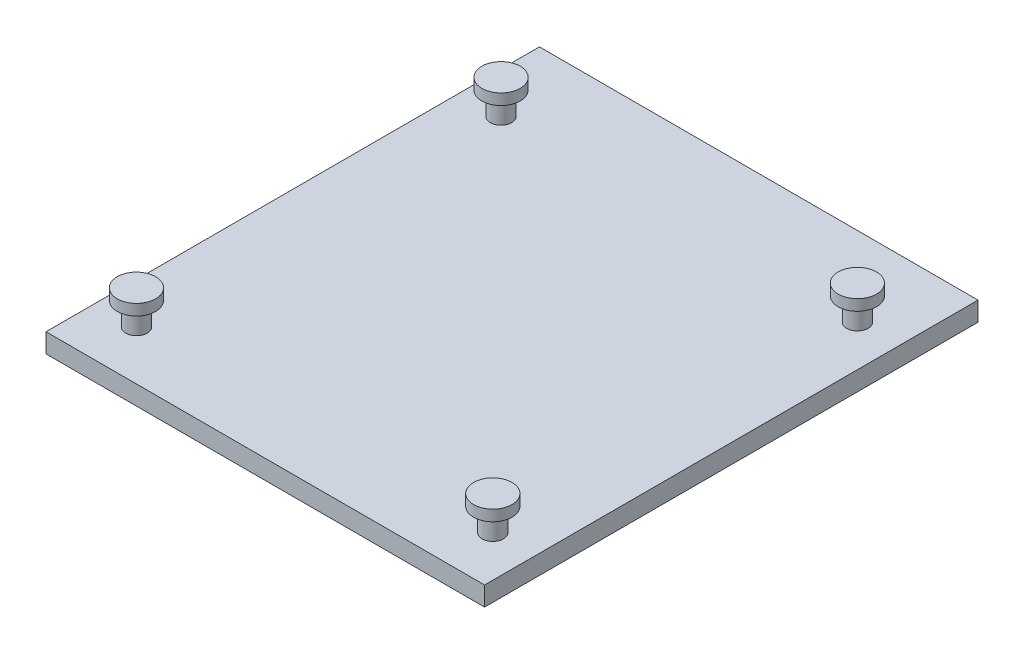
ISO-10303-21;
HEADER;
FILE_DESCRIPTION(('STEP AP214'),'2;1');
FILE_NAME('part.step','',(''),(''),'','','');
FILE_SCHEMA(('AUTOMOTIVE_DESIGN { 1 0 10303 214 1 1 1 1 }'));
ENDSEC;
DATA;
#1=APPLICATION_CONTEXT('core data for automotive mechanical design processes');
#2=APPLICATION_PROTOCOL_DEFINITION('international standard','automotive_design',2000,#1);
#3=PRODUCT_CONTEXT('',#1,'mechanical');
#4=PRODUCT('Part','Part','',(#3));
#5=PRODUCT_RELATED_PRODUCT_CATEGORY('part','',(#4));
#6=PRODUCT_DEFINITION_FORMATION('','',#4);
#7=PRODUCT_DEFINITION_CONTEXT('part definition',#1,'design');
#8=PRODUCT_DEFINITION('design','',#6,#7);
#9=PRODUCT_DEFINITION_SHAPE('','',#8);
#10=(LENGTH_UNIT() NAMED_UNIT(*) SI_UNIT(.MILLI.,.METRE.));
#11=(NAMED_UNIT(*) PLANE_ANGLE_UNIT() SI_UNIT($,.RADIAN.));
#12=(NAMED_UNIT(*) SI_UNIT($,.STERADIAN.) SOLID_ANGLE_UNIT());
#13=UNCERTAINTY_MEASURE_WITH_UNIT(LENGTH_MEASURE(1.E-05),#10,'distance_accuracy_value','');
#14=(GEOMETRIC_REPRESENTATION_CONTEXT(3) GLOBAL_UNCERTAINTY_ASSIGNED_CONTEXT((#13)) GLOBAL_UNIT_ASSIGNED_CONTEXT((#10,
#11,#12)) REPRESENTATION_CONTEXT('',''));
#15=CARTESIAN_POINT('',(0.,0.,0.));
#16=DIRECTION('',(0.,0.,1.));
#17=DIRECTION('',(1.,0.,0.));
#18=AXIS2_PLACEMENT_3D('',#15,#16,#17);
#19=CARTESIAN_POINT('',(40.,-3.5,45.));
#20=DIRECTION('',(1.,0.,0.));
#21=DIRECTION('',(0.,0.,-1.));
#22=AXIS2_PLACEMENT_3D('',#19,#20,#21);
#23=PLANE('',#22);
#24=DIRECTION('',(0.,0.,-1.));
#25=VECTOR('',#24,1.);
#26=CARTESIAN_POINT('',(40.,0.,45.));
#27=LINE('',#26,#25);
#28=CARTESIAN_POINT('',(40.,0.,45.));
#29=VERTEX_POINT('',#28);
#30=CARTESIAN_POINT('',(40.,0.,-45.));
#31=VERTEX_POINT('',#30);
#32=EDGE_CURVE('E113',#29,#31,#27,.T.);
#33=ORIENTED_EDGE('',*,*,#32,.F.);
#34=DIRECTION('',(0.,1.,0.));
#35=VECTOR('',#34,1.);
#36=CARTESIAN_POINT('',(40.,-3.5,45.));
#37=LINE('',#36,#35);
#38=CARTESIAN_POINT('',(40.,-3.5,45.));
#39=VERTEX_POINT('',#38);
#40=EDGE_CURVE('E56',#39,#29,#37,.T.);
#41=ORIENTED_EDGE('',*,*,#40,.F.);
#42=DIRECTION('',(0.,0.,-1.));
#43=VECTOR('',#42,1.);
#44=CARTESIAN_POINT('',(40.,-3.5,45.));
#45=LINE('',#44,#43);
#46=CARTESIAN_POINT('',(40.,-3.5,-45.));
#47=VERTEX_POINT('',#46);
#48=EDGE_CURVE('E104',#39,#47,#45,.T.);
#49=ORIENTED_EDGE('',*,*,#48,.T.);
#50=DIRECTION('',(0.,1.,0.));
#51=VECTOR('',#50,1.);
#52=CARTESIAN_POINT('',(40.,-3.5,-45.));
#53=LINE('',#52,#51);
#54=EDGE_CURVE('E84',#47,#31,#53,.T.);
#55=ORIENTED_EDGE('',*,*,#54,.T.);
#56=EDGE_LOOP('',(#33,#41,#49,#55));
#57=FACE_BOUND('',#56,.T.);
#58=ADVANCED_FACE('F39',(#57),#23,.T.);
#59=CARTESIAN_POINT('',(-40.,-3.5,45.));
#60=DIRECTION('',(0.,0.,1.));
#61=DIRECTION('',(1.,0.,0.));
#62=AXIS2_PLACEMENT_3D('',#59,#60,#61);
#63=PLANE('',#62);
#64=DIRECTION('',(1.,0.,0.));
#65=VECTOR('',#64,1.);
#66=CARTESIAN_POINT('',(-40.,0.,45.));
#67=LINE('',#66,#65);
#68=CARTESIAN_POINT('',(-40.,0.,45.));
#69=VERTEX_POINT('',#68);
#70=EDGE_CURVE('E107',#69,#29,#67,.T.);
#71=ORIENTED_EDGE('',*,*,#70,.F.);
#72=DIRECTION('',(0.,1.,0.));
#73=VECTOR('',#72,1.);
#74=CARTESIAN_POINT('',(-40.,-3.5,45.));
#75=LINE('',#74,#73);
#76=CARTESIAN_POINT('',(-40.,-3.5,45.));
#77=VERTEX_POINT('',#76);
#78=EDGE_CURVE('E73',#77,#69,#75,.T.);
#79=ORIENTED_EDGE('',*,*,#78,.F.);
#80=DIRECTION('',(1.,0.,0.));
#81=VECTOR('',#80,1.);
#82=CARTESIAN_POINT('',(-40.,-3.5,45.));
#83=LINE('',#82,#81);
#84=EDGE_CURVE('E99',#77,#39,#83,.T.);
#85=ORIENTED_EDGE('',*,*,#84,.T.);
#86=ORIENTED_EDGE('',*,*,#40,.T.);
#87=EDGE_LOOP('',(#71,#79,#85,#86));
#88=FACE_BOUND('',#87,.T.);
#89=ADVANCED_FACE('F155',(#88),#63,.T.);
#90=CARTESIAN_POINT('',(-40.,-3.5,45.));
#91=DIRECTION('',(-1.,0.,0.));
#92=DIRECTION('',(0.,0.,1.));
#93=AXIS2_PLACEMENT_3D('',#90,#91,#92);
#94=PLANE('',#93);
#95=DIRECTION('',(0.,0.,1.));
#96=VECTOR('',#95,1.);
#97=CARTESIAN_POINT('',(-40.,0.,45.));
#98=LINE('',#97,#96);
#99=CARTESIAN_POINT('',(-40.,0.,-45.));
#100=VERTEX_POINT('',#99);
#101=EDGE_CURVE('E92',#100,#69,#98,.T.);
#102=ORIENTED_EDGE('',*,*,#101,.F.);
#103=DIRECTION('',(0.,1.,0.));
#104=VECTOR('',#103,1.);
#105=CARTESIAN_POINT('',(-40.,-3.5,-45.));
#106=LINE('',#105,#104);
#107=CARTESIAN_POINT('',(-40.,-3.5,-45.));
#108=VERTEX_POINT('',#107);
#109=EDGE_CURVE('E87',#108,#100,#106,.T.);
#110=ORIENTED_EDGE('',*,*,#109,.F.);
#111=DIRECTION('',(0.,0.,1.));
#112=VECTOR('',#111,1.);
#113=CARTESIAN_POINT('',(-40.,-3.5,45.));
#114=LINE('',#113,#112);
#115=EDGE_CURVE('E90',#108,#77,#114,.T.);
#116=ORIENTED_EDGE('',*,*,#115,.T.);
#117=ORIENTED_EDGE('',*,*,#78,.T.);
#118=EDGE_LOOP('',(#102,#110,#116,#117));
#119=FACE_BOUND('',#118,.T.);
#120=ADVANCED_FACE('F89',(#119),#94,.T.);
#121=CARTESIAN_POINT('',(-40.,-3.5,-45.));
#122=DIRECTION('',(0.,0.,-1.));
#123=DIRECTION('',(-1.,0.,0.));
#124=AXIS2_PLACEMENT_3D('',#121,#122,#123);
#125=PLANE('',#124);
#126=DIRECTION('',(-1.,0.,0.));
#127=VECTOR('',#126,1.);
#128=CARTESIAN_POINT('',(-40.,0.,-45.));
#129=LINE('',#128,#127);
#130=EDGE_CURVE('E117',#31,#100,#129,.T.);
#131=ORIENTED_EDGE('',*,*,#130,.F.);
#132=ORIENTED_EDGE('',*,*,#54,.F.);
#133=DIRECTION('',(-1.,0.,0.));
#134=VECTOR('',#133,1.);
#135=CARTESIAN_POINT('',(-40.,-3.5,-45.));
#136=LINE('',#135,#134);
#137=EDGE_CURVE('E98',#47,#108,#136,.T.);
#138=ORIENTED_EDGE('',*,*,#137,.T.);
#139=ORIENTED_EDGE('',*,*,#109,.T.);
#140=EDGE_LOOP('',(#131,#132,#138,#139));
#141=FACE_BOUND('',#140,.T.);
#142=ADVANCED_FACE('F102',(#141),#125,.T.);
#143=CARTESIAN_POINT('',(0.,-3.5,0.));
#144=DIRECTION('',(0.,-1.,0.));
#145=DIRECTION('',(0.,0.,-1.));
#146=AXIS2_PLACEMENT_3D('',#143,#144,#145);
#147=PLANE('',#146);
#148=ORIENTED_EDGE('',*,*,#48,.F.);
#149=ORIENTED_EDGE('',*,*,#84,.F.);
#150=ORIENTED_EDGE('',*,*,#115,.F.);
#151=ORIENTED_EDGE('',*,*,#137,.F.);
#152=EDGE_LOOP('',(#148,#149,#150,#151));
#153=FACE_BOUND('',#152,.T.);
#154=ADVANCED_FACE('F97',(#153),#147,.T.);
#155=CARTESIAN_POINT('',(0.,0.,0.));
#156=DIRECTION('',(0.,-1.,0.));
#157=DIRECTION('',(0.,0.,-1.));
#158=AXIS2_PLACEMENT_3D('',#155,#156,#157);
#159=PLANE('',#158);
#160=CARTESIAN_POINT('',(-32.5,0.,36.));
#161=DIRECTION('',(0.,-1.,0.));
#162=DIRECTION('',(0.,0.,-1.));
#163=AXIS2_PLACEMENT_3D('',#160,#161,#162);
#164=CIRCLE('',#163,1.95);
#165=CARTESIAN_POINT('',(-32.5,0.,34.05));
#166=VERTEX_POINT('',#165);
#167=EDGE_CURVE('E11',#166,#166,#164,.F.);
#168=ORIENTED_EDGE('',*,*,#167,.F.);
#169=EDGE_LOOP('',(#168));
#170=FACE_BOUND('',#169,.T.);
#171=CARTESIAN_POINT('',(32.5,0.,36.));
#172=DIRECTION('',(0.,-1.,0.));
#173=DIRECTION('',(0.,0.,-1.));
#174=AXIS2_PLACEMENT_3D('',#171,#172,#173);
#175=CIRCLE('',#174,1.95);
#176=CARTESIAN_POINT('',(32.5,0.,34.05));
#177=VERTEX_POINT('',#176);
#178=EDGE_CURVE('E48',#177,#177,#175,.F.);
#179=ORIENTED_EDGE('',*,*,#178,.F.);
#180=EDGE_LOOP('',(#179));
#181=FACE_BOUND('',#180,.T.);
#182=CARTESIAN_POINT('',(32.5,0.,-30.5));
#183=DIRECTION('',(0.,-1.,0.));
#184=DIRECTION('',(0.,0.,-1.));
#185=AXIS2_PLACEMENT_3D('',#182,#183,#184);
#186=CIRCLE('',#185,1.95);
#187=CARTESIAN_POINT('',(32.5,0.,-32.45));
#188=VERTEX_POINT('',#187);
#189=EDGE_CURVE('E136',#188,#188,#186,.F.);
#190=ORIENTED_EDGE('',*,*,#189,.F.);
#191=EDGE_LOOP('',(#190));
#192=FACE_BOUND('',#191,.T.);
#193=CARTESIAN_POINT('',(-32.5,0.,-30.5));
#194=DIRECTION('',(0.,-1.,0.));
#195=DIRECTION('',(0.,0.,-1.));
#196=AXIS2_PLACEMENT_3D('',#193,#194,#195);
#197=CIRCLE('',#196,1.95);
#198=CARTESIAN_POINT('',(-32.5,0.,-32.45));
#199=VERTEX_POINT('',#198);
#200=EDGE_CURVE('E128',#199,#199,#197,.F.);
#201=ORIENTED_EDGE('',*,*,#200,.F.);
#202=EDGE_LOOP('',(#201));
#203=FACE_BOUND('',#202,.T.);
#204=ORIENTED_EDGE('',*,*,#32,.T.);
#205=ORIENTED_EDGE('',*,*,#130,.T.);
#206=ORIENTED_EDGE('',*,*,#101,.T.);
#207=ORIENTED_EDGE('',*,*,#70,.T.);
#208=EDGE_LOOP('',(#204,#205,#206,#207));
#209=FACE_BOUND('',#208,.T.);
#210=ADVANCED_FACE('F145',(#170,#181,#192,#203,#209),#159,.F.);
#211=CARTESIAN_POINT('',(-32.5,4.2,-30.5));
#212=DIRECTION('',(0.,-1.,0.));
#213=DIRECTION('',(0.,0.,-1.));
#214=AXIS2_PLACEMENT_3D('',#211,#212,#213);
#215=CYLINDRICAL_SURFACE('',#214,1.95);
#216=CARTESIAN_POINT('',(-32.5,4.2,-30.5));
#217=DIRECTION('',(0.,1.,0.));
#218=DIRECTION('',(0.,0.,1.));
#219=AXIS2_PLACEMENT_3D('',#216,#217,#218);
#220=CIRCLE('',#219,1.95);
#221=CARTESIAN_POINT('',(-32.5,4.2,-28.55));
#222=VERTEX_POINT('',#221);
#223=EDGE_CURVE('E118',#222,#222,#220,.T.);
#224=ORIENTED_EDGE('',*,*,#223,.F.);
#225=EDGE_LOOP('',(#224));
#226=FACE_BOUND('',#225,.T.);
#227=ORIENTED_EDGE('',*,*,#200,.T.);
#228=EDGE_LOOP('',(#227));
#229=FACE_BOUND('',#228,.T.);
#230=ADVANCED_FACE('F148',(#226,#229),#215,.T.);
#231=CARTESIAN_POINT('',(32.5,4.2,-30.5));
#232=DIRECTION('',(0.,-1.,0.));
#233=DIRECTION('',(0.,0.,-1.));
#234=AXIS2_PLACEMENT_3D('',#231,#232,#233);
#235=CYLINDRICAL_SURFACE('',#234,1.95);
#236=CARTESIAN_POINT('',(32.5,4.2,-30.5));
#237=DIRECTION('',(0.,1.,0.));
#238=DIRECTION('',(0.,0.,1.));
#239=AXIS2_PLACEMENT_3D('',#236,#237,#238);
#240=CIRCLE('',#239,1.95);
#241=CARTESIAN_POINT('',(32.5,4.2,-28.55));
#242=VERTEX_POINT('',#241);
#243=EDGE_CURVE('E276',#242,#242,#240,.T.);
#244=ORIENTED_EDGE('',*,*,#243,.F.);
#245=EDGE_LOOP('',(#244));
#246=FACE_BOUND('',#245,.T.);
#247=ORIENTED_EDGE('',*,*,#189,.T.);
#248=EDGE_LOOP('',(#247));
#249=FACE_BOUND('',#248,.T.);
#250=ADVANCED_FACE('F173',(#246,#249),#235,.T.);
#251=CARTESIAN_POINT('',(32.5,4.2,36.));
#252=DIRECTION('',(0.,-1.,0.));
#253=DIRECTION('',(0.,0.,-1.));
#254=AXIS2_PLACEMENT_3D('',#251,#252,#253);
#255=CYLINDRICAL_SURFACE('',#254,1.95);
#256=CARTESIAN_POINT('',(32.5,4.2,36.));
#257=DIRECTION('',(0.,1.,0.));
#258=DIRECTION('',(0.,0.,1.));
#259=AXIS2_PLACEMENT_3D('',#256,#257,#258);
#260=CIRCLE('',#259,1.95);
#261=CARTESIAN_POINT('',(32.5,4.2,37.95));
#262=VERTEX_POINT('',#261);
#263=EDGE_CURVE('E272',#262,#262,#260,.T.);
#264=ORIENTED_EDGE('',*,*,#263,.F.);
#265=EDGE_LOOP('',(#264));
#266=FACE_BOUND('',#265,.T.);
#267=ORIENTED_EDGE('',*,*,#178,.T.);
#268=EDGE_LOOP('',(#267));
#269=FACE_BOUND('',#268,.T.);
#270=ADVANCED_FACE('F143',(#266,#269),#255,.T.);
#271=CARTESIAN_POINT('',(-32.5,4.2,36.));
#272=DIRECTION('',(0.,-1.,0.));
#273=DIRECTION('',(0.,0.,-1.));
#274=AXIS2_PLACEMENT_3D('',#271,#272,#273);
#275=CYLINDRICAL_SURFACE('',#274,1.95);
#276=CARTESIAN_POINT('',(-32.5,4.2,36.));
#277=DIRECTION('',(0.,1.,0.));
#278=DIRECTION('',(0.,0.,1.));
#279=AXIS2_PLACEMENT_3D('',#276,#277,#278);
#280=CIRCLE('',#279,1.95);
#281=CARTESIAN_POINT('',(-32.5,4.2,37.95));
#282=VERTEX_POINT('',#281);
#283=EDGE_CURVE('E265',#282,#282,#280,.T.);
#284=ORIENTED_EDGE('',*,*,#283,.F.);
#285=EDGE_LOOP('',(#284));
#286=FACE_BOUND('',#285,.T.);
#287=ORIENTED_EDGE('',*,*,#167,.T.);
#288=EDGE_LOOP('',(#287));
#289=FACE_BOUND('',#288,.T.);
#290=ADVANCED_FACE('F180',(#286,#289),#275,.T.);
#291=CARTESIAN_POINT('',(-32.5,6.2,-30.5));
#292=DIRECTION('',(0.,-1.,0.));
#293=DIRECTION('',(0.,0.,-1.));
#294=AXIS2_PLACEMENT_3D('',#291,#292,#293);
#295=CYLINDRICAL_SURFACE('',#294,3.5);
#296=CARTESIAN_POINT('',(-32.5,6.2,-30.5));
#297=DIRECTION('',(0.,1.,0.));
#298=DIRECTION('',(0.,0.,1.));
#299=AXIS2_PLACEMENT_3D('',#296,#297,#298);
#300=CIRCLE('',#299,3.5);
#301=CARTESIAN_POINT('',(-32.5,6.2,-27.));
#302=VERTEX_POINT('',#301);
#303=EDGE_CURVE('E261',#302,#302,#300,.T.);
#304=ORIENTED_EDGE('',*,*,#303,.F.);
#305=EDGE_LOOP('',(#304));
#306=FACE_BOUND('',#305,.T.);
#307=CARTESIAN_POINT('',(-32.5,4.2,-30.5));
#308=DIRECTION('',(0.,1.,0.));
#309=DIRECTION('',(0.,0.,1.));
#310=AXIS2_PLACEMENT_3D('',#307,#308,#309);
#311=CIRCLE('',#310,3.5);
#312=CARTESIAN_POINT('',(-32.5,4.2,-27.));
#313=VERTEX_POINT('',#312);
#314=EDGE_CURVE('E257',#313,#313,#311,.T.);
#315=ORIENTED_EDGE('',*,*,#314,.T.);
#316=EDGE_LOOP('',(#315));
#317=FACE_BOUND('',#316,.T.);
#318=ADVANCED_FACE('F184',(#306,#317),#295,.T.);
#319=CARTESIAN_POINT('',(-32.5,6.2,-30.5));
#320=DIRECTION('',(0.,1.,0.));
#321=DIRECTION('',(0.,0.,1.));
#322=AXIS2_PLACEMENT_3D('',#319,#320,#321);
#323=PLANE('',#322);
#324=ORIENTED_EDGE('',*,*,#303,.T.);
#325=EDGE_LOOP('',(#324));
#326=FACE_BOUND('',#325,.T.);
#327=ADVANCED_FACE('F188',(#326),#323,.T.);
#328=CARTESIAN_POINT('',(-32.5,4.2,-30.5));
#329=DIRECTION('',(0.,1.,0.));
#330=DIRECTION('',(0.,0.,1.));
#331=AXIS2_PLACEMENT_3D('',#328,#329,#330);
#332=PLANE('',#331);
#333=ORIENTED_EDGE('',*,*,#223,.T.);
#334=EDGE_LOOP('',(#333));
#335=FACE_BOUND('',#334,.T.);
#336=ORIENTED_EDGE('',*,*,#314,.F.);
#337=EDGE_LOOP('',(#336));
#338=FACE_BOUND('',#337,.T.);
#339=ADVANCED_FACE('F190',(#335,#338),#332,.F.);
#340=CARTESIAN_POINT('',(32.5,6.2,-30.5));
#341=DIRECTION('',(0.,-1.,0.));
#342=DIRECTION('',(0.,0.,-1.));
#343=AXIS2_PLACEMENT_3D('',#340,#341,#342);
#344=CYLINDRICAL_SURFACE('',#343,3.5);
#345=CARTESIAN_POINT('',(32.5,6.2,-30.5));
#346=DIRECTION('',(0.,1.,0.));
#347=DIRECTION('',(0.,0.,1.));
#348=AXIS2_PLACEMENT_3D('',#345,#346,#347);
#349=CIRCLE('',#348,3.5);
#350=CARTESIAN_POINT('',(32.5,6.2,-27.));
#351=VERTEX_POINT('',#350);
#352=EDGE_CURVE('E253',#351,#351,#349,.T.);
#353=ORIENTED_EDGE('',*,*,#352,.F.);
#354=EDGE_LOOP('',(#353));
#355=FACE_BOUND('',#354,.T.);
#356=CARTESIAN_POINT('',(32.5,4.2,-30.5));
#357=DIRECTION('',(0.,1.,0.));
#358=DIRECTION('',(0.,0.,1.));
#359=AXIS2_PLACEMENT_3D('',#356,#357,#358);
#360=CIRCLE('',#359,3.5);
#361=CARTESIAN_POINT('',(32.5,4.2,-27.));
#362=VERTEX_POINT('',#361);
#363=EDGE_CURVE('E251',#362,#362,#360,.T.);
#364=ORIENTED_EDGE('',*,*,#363,.T.);
#365=EDGE_LOOP('',(#364));
#366=FACE_BOUND('',#365,.T.);
#367=ADVANCED_FACE('F193',(#355,#366),#344,.T.);
#368=CARTESIAN_POINT('',(32.5,6.2,-30.5));
#369=DIRECTION('',(0.,1.,0.));
#370=DIRECTION('',(0.,0.,1.));
#371=AXIS2_PLACEMENT_3D('',#368,#369,#370);
#372=PLANE('',#371);
#373=ORIENTED_EDGE('',*,*,#352,.T.);
#374=EDGE_LOOP('',(#373));
#375=FACE_BOUND('',#374,.T.);
#376=ADVANCED_FACE('F200',(#375),#372,.T.);
#377=CARTESIAN_POINT('',(32.5,4.2,-30.5));
#378=DIRECTION('',(0.,1.,0.));
#379=DIRECTION('',(0.,0.,1.));
#380=AXIS2_PLACEMENT_3D('',#377,#378,#379);
#381=PLANE('',#380);
#382=ORIENTED_EDGE('',*,*,#243,.T.);
#383=EDGE_LOOP('',(#382));
#384=FACE_BOUND('',#383,.T.);
#385=ORIENTED_EDGE('',*,*,#363,.F.);
#386=EDGE_LOOP('',(#385));
#387=FACE_BOUND('',#386,.T.);
#388=ADVANCED_FACE('F202',(#384,#387),#381,.F.);
#389=CARTESIAN_POINT('',(-32.5,6.2,36.));
#390=DIRECTION('',(0.,-1.,0.));
#391=DIRECTION('',(0.,0.,-1.));
#392=AXIS2_PLACEMENT_3D('',#389,#390,#391);
#393=CYLINDRICAL_SURFACE('',#392,3.5);
#394=CARTESIAN_POINT('',(-32.5,6.2,36.));
#395=DIRECTION('',(0.,1.,0.));
#396=DIRECTION('',(0.,0.,1.));
#397=AXIS2_PLACEMENT_3D('',#394,#395,#396);
#398=CIRCLE('',#397,3.5);
#399=CARTESIAN_POINT('',(-32.5,6.2,39.5));
#400=VERTEX_POINT('',#399);
#401=EDGE_CURVE('E244',#400,#400,#398,.T.);
#402=ORIENTED_EDGE('',*,*,#401,.F.);
#403=EDGE_LOOP('',(#402));
#404=FACE_BOUND('',#403,.T.);
#405=CARTESIAN_POINT('',(-32.5,4.2,36.));
#406=DIRECTION('',(0.,1.,0.));
#407=DIRECTION('',(0.,0.,1.));
#408=AXIS2_PLACEMENT_3D('',#405,#406,#407);
#409=CIRCLE('',#408,3.5);
#410=CARTESIAN_POINT('',(-32.5,4.2,39.5));
#411=VERTEX_POINT('',#410);
#412=EDGE_CURVE('E238',#411,#411,#409,.T.);
#413=ORIENTED_EDGE('',*,*,#412,.T.);
#414=EDGE_LOOP('',(#413));
#415=FACE_BOUND('',#414,.T.);
#416=ADVANCED_FACE('F205',(#404,#415),#393,.T.);
#417=CARTESIAN_POINT('',(-32.5,6.2,36.));
#418=DIRECTION('',(0.,1.,0.));
#419=DIRECTION('',(0.,0.,1.));
#420=AXIS2_PLACEMENT_3D('',#417,#418,#419);
#421=PLANE('',#420);
#422=ORIENTED_EDGE('',*,*,#401,.T.);
#423=EDGE_LOOP('',(#422));
#424=FACE_BOUND('',#423,.T.);
#425=ADVANCED_FACE('F212',(#424),#421,.T.);
#426=CARTESIAN_POINT('',(-32.5,4.2,36.));
#427=DIRECTION('',(0.,1.,0.));
#428=DIRECTION('',(0.,0.,1.));
#429=AXIS2_PLACEMENT_3D('',#426,#427,#428);
#430=PLANE('',#429);
#431=ORIENTED_EDGE('',*,*,#283,.T.);
#432=EDGE_LOOP('',(#431));
#433=FACE_BOUND('',#432,.T.);
#434=ORIENTED_EDGE('',*,*,#412,.F.);
#435=EDGE_LOOP('',(#434));
#436=FACE_BOUND('',#435,.T.);
#437=ADVANCED_FACE('F214',(#433,#436),#430,.F.);
#438=CARTESIAN_POINT('',(32.5,6.2,36.));
#439=DIRECTION('',(0.,-1.,0.));
#440=DIRECTION('',(0.,0.,-1.));
#441=AXIS2_PLACEMENT_3D('',#438,#439,#440);
#442=CYLINDRICAL_SURFACE('',#441,3.5);
#443=CARTESIAN_POINT('',(32.5,6.2,36.));
#444=DIRECTION('',(0.,1.,0.));
#445=DIRECTION('',(0.,0.,1.));
#446=AXIS2_PLACEMENT_3D('',#443,#444,#445);
#447=CIRCLE('',#446,3.5);
#448=CARTESIAN_POINT('',(32.5,6.2,39.5));
#449=VERTEX_POINT('',#448);
#450=EDGE_CURVE('E236',#449,#449,#447,.T.);
#451=ORIENTED_EDGE('',*,*,#450,.F.);
#452=EDGE_LOOP('',(#451));
#453=FACE_BOUND('',#452,.T.);
#454=CARTESIAN_POINT('',(32.5,4.2,36.));
#455=DIRECTION('',(0.,1.,0.));
#456=DIRECTION('',(0.,0.,1.));
#457=AXIS2_PLACEMENT_3D('',#454,#455,#456);
#458=CIRCLE('',#457,3.5);
#459=CARTESIAN_POINT('',(32.5,4.2,39.5));
#460=VERTEX_POINT('',#459);
#461=EDGE_CURVE('E239',#460,#460,#458,.T.);
#462=ORIENTED_EDGE('',*,*,#461,.T.);
#463=EDGE_LOOP('',(#462));
#464=FACE_BOUND('',#463,.T.);
#465=ADVANCED_FACE('F217',(#453,#464),#442,.T.);
#466=CARTESIAN_POINT('',(32.5,6.2,36.));
#467=DIRECTION('',(0.,1.,0.));
#468=DIRECTION('',(0.,0.,1.));
#469=AXIS2_PLACEMENT_3D('',#466,#467,#468);
#470=PLANE('',#469);
#471=ORIENTED_EDGE('',*,*,#450,.T.);
#472=EDGE_LOOP('',(#471));
#473=FACE_BOUND('',#472,.T.);
#474=ADVANCED_FACE('F224',(#473),#470,.T.);
#475=CARTESIAN_POINT('',(32.5,4.2,36.));
#476=DIRECTION('',(0.,1.,0.));
#477=DIRECTION('',(0.,0.,1.));
#478=AXIS2_PLACEMENT_3D('',#475,#476,#477);
#479=PLANE('',#478);
#480=ORIENTED_EDGE('',*,*,#263,.T.);
#481=EDGE_LOOP('',(#480));
#482=FACE_BOUND('',#481,.T.);
#483=ORIENTED_EDGE('',*,*,#461,.F.);
#484=EDGE_LOOP('',(#483));
#485=FACE_BOUND('',#484,.T.);
#486=ADVANCED_FACE('F226',(#482,#485),#479,.F.);
#487=CLOSED_SHELL('',(#58,#89,#120,#142,#154,#210,#230,#250,#270,#290,#318,#327,#339,#367,#376,
#388,#416,#425,#437,#465,#474,#486));
#488=MANIFOLD_SOLID_BREP('B2',#487);
#489=ADVANCED_BREP_SHAPE_REPRESENTATION('',(#18,#488),#14);
#490=SHAPE_DEFINITION_REPRESENTATION(#9,#489);
ENDSEC;
END-ISO-10303-21;
